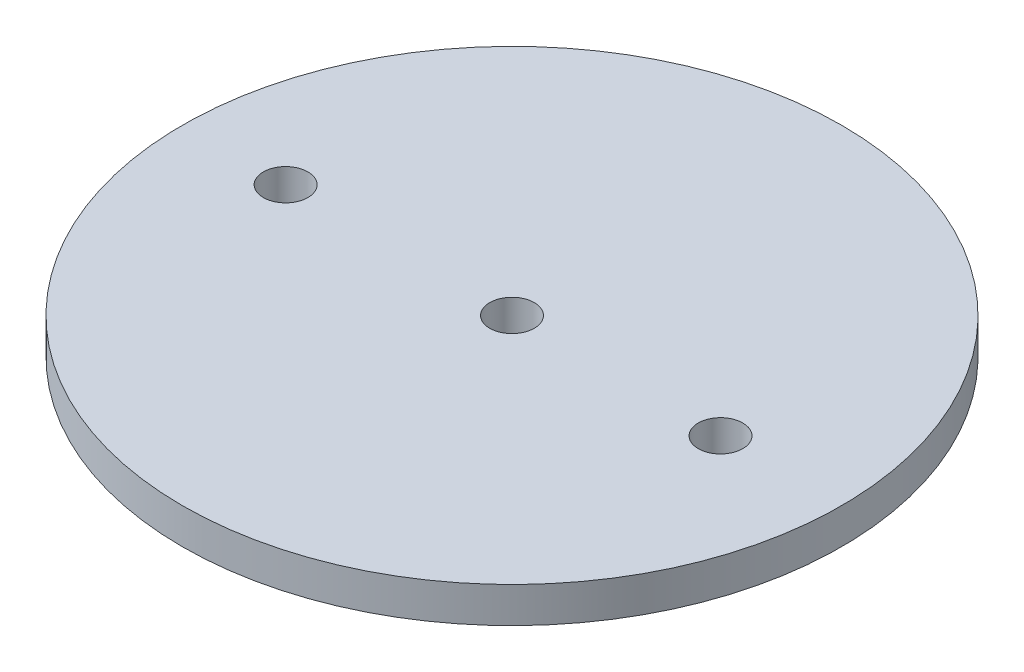
ISO-10303-21;
HEADER;
FILE_DESCRIPTION(('STEP AP214'),'2;1');
FILE_NAME('part.step','',(''),(''),'','','');
FILE_SCHEMA(('AUTOMOTIVE_DESIGN { 1 0 10303 214 1 1 1 1 }'));
ENDSEC;
DATA;
#1=APPLICATION_CONTEXT('core data for automotive mechanical design processes');
#2=APPLICATION_PROTOCOL_DEFINITION('international standard','automotive_design',2000,#1);
#3=PRODUCT_CONTEXT('',#1,'mechanical');
#4=PRODUCT('Part','Part','',(#3));
#5=PRODUCT_RELATED_PRODUCT_CATEGORY('part','',(#4));
#6=PRODUCT_DEFINITION_FORMATION('','',#4);
#7=PRODUCT_DEFINITION_CONTEXT('part definition',#1,'design');
#8=PRODUCT_DEFINITION('design','',#6,#7);
#9=PRODUCT_DEFINITION_SHAPE('','',#8);
#10=(LENGTH_UNIT() NAMED_UNIT(*) SI_UNIT(.MILLI.,.METRE.));
#11=(NAMED_UNIT(*) PLANE_ANGLE_UNIT() SI_UNIT($,.RADIAN.));
#12=(NAMED_UNIT(*) SI_UNIT($,.STERADIAN.) SOLID_ANGLE_UNIT());
#13=UNCERTAINTY_MEASURE_WITH_UNIT(LENGTH_MEASURE(1.E-05),#10,'distance_accuracy_value','');
#14=(GEOMETRIC_REPRESENTATION_CONTEXT(3) GLOBAL_UNCERTAINTY_ASSIGNED_CONTEXT((#13)) GLOBAL_UNIT_ASSIGNED_CONTEXT((#10,
#11,#12)) REPRESENTATION_CONTEXT('',''));
#15=CARTESIAN_POINT('',(0.,0.,0.));
#16=DIRECTION('',(0.,0.,1.));
#17=DIRECTION('',(1.,0.,0.));
#18=AXIS2_PLACEMENT_3D('',#15,#16,#17);
#19=CARTESIAN_POINT('',(0.,5.08,0.));
#20=DIRECTION('',(0.,-1.,0.));
#21=DIRECTION('',(0.,0.,-1.));
#22=AXIS2_PLACEMENT_3D('',#19,#20,#21);
#23=CYLINDRICAL_SURFACE('',#22,46.99);
#24=CARTESIAN_POINT('',(0.,5.08,0.));
#25=DIRECTION('',(0.,1.,0.));
#26=DIRECTION('',(0.,0.,1.));
#27=AXIS2_PLACEMENT_3D('',#24,#25,#26);
#28=CIRCLE('',#27,46.99);
#29=CARTESIAN_POINT('',(0.,5.08,46.99));
#30=VERTEX_POINT('',#29);
#31=EDGE_CURVE('E10',#30,#30,#28,.T.);
#32=ORIENTED_EDGE('',*,*,#31,.F.);
#33=EDGE_LOOP('',(#32));
#34=FACE_BOUND('',#33,.T.);
#35=CARTESIAN_POINT('',(0.,0.,0.));
#36=DIRECTION('',(0.,1.,0.));
#37=DIRECTION('',(0.,0.,1.));
#38=AXIS2_PLACEMENT_3D('',#35,#36,#37);
#39=CIRCLE('',#38,46.99);
#40=CARTESIAN_POINT('',(0.,0.,46.99));
#41=VERTEX_POINT('',#40);
#42=EDGE_CURVE('E40',#41,#41,#39,.T.);
#43=ORIENTED_EDGE('',*,*,#42,.T.);
#44=EDGE_LOOP('',(#43));
#45=FACE_BOUND('',#44,.T.);
#46=ADVANCED_FACE('F37',(#34,#45),#23,.T.);
#47=CARTESIAN_POINT('',(0.,5.08,0.));
#48=DIRECTION('',(0.,1.,0.));
#49=DIRECTION('',(0.,0.,1.));
#50=AXIS2_PLACEMENT_3D('',#47,#48,#49);
#51=PLANE('',#50);
#52=CARTESIAN_POINT('',(-32.2779718521836,5.08,0.));
#53=DIRECTION('',(0.,1.,0.));
#54=DIRECTION('',(0.,0.,1.));
#55=AXIS2_PLACEMENT_3D('',#52,#53,#54);
#56=CIRCLE('',#55,3.175);
#57=CARTESIAN_POINT('',(-32.2779718521836,5.08,3.175));
#58=VERTEX_POINT('',#57);
#59=EDGE_CURVE('E67',#58,#58,#56,.T.);
#60=ORIENTED_EDGE('',*,*,#59,.F.);
#61=EDGE_LOOP('',(#60));
#62=FACE_BOUND('',#61,.T.);
#63=CARTESIAN_POINT('',(0.,5.08,0.));
#64=DIRECTION('',(0.,1.,0.));
#65=DIRECTION('',(0.,0.,1.));
#66=AXIS2_PLACEMENT_3D('',#63,#64,#65);
#67=CIRCLE('',#66,3.175);
#68=CARTESIAN_POINT('',(0.,5.08,3.175));
#69=VERTEX_POINT('',#68);
#70=EDGE_CURVE('E59',#69,#69,#67,.T.);
#71=ORIENTED_EDGE('',*,*,#70,.F.);
#72=EDGE_LOOP('',(#71));
#73=FACE_BOUND('',#72,.T.);
#74=CARTESIAN_POINT('',(29.7300213393057,5.08,0.));
#75=DIRECTION('',(0.,1.,0.));
#76=DIRECTION('',(0.,0.,1.));
#77=AXIS2_PLACEMENT_3D('',#74,#75,#76);
#78=CIRCLE('',#77,3.175);
#79=CARTESIAN_POINT('',(29.7300213393057,5.08,3.175));
#80=VERTEX_POINT('',#79);
#81=EDGE_CURVE('E51',#80,#80,#78,.T.);
#82=ORIENTED_EDGE('',*,*,#81,.F.);
#83=EDGE_LOOP('',(#82));
#84=FACE_BOUND('',#83,.T.);
#85=ORIENTED_EDGE('',*,*,#31,.T.);
#86=EDGE_LOOP('',(#85));
#87=FACE_BOUND('',#86,.T.);
#88=ADVANCED_FACE('F85',(#62,#73,#84,#87),#51,.T.);
#89=CARTESIAN_POINT('',(0.,0.,0.));
#90=DIRECTION('',(0.,1.,0.));
#91=DIRECTION('',(0.,0.,1.));
#92=AXIS2_PLACEMENT_3D('',#89,#90,#91);
#93=PLANE('',#92);
#94=CARTESIAN_POINT('',(-32.2779718521836,0.,0.));
#95=DIRECTION('',(0.,1.,0.));
#96=DIRECTION('',(0.,0.,1.));
#97=AXIS2_PLACEMENT_3D('',#94,#95,#96);
#98=CIRCLE('',#97,3.175);
#99=CARTESIAN_POINT('',(-32.2779718521836,0.,3.175));
#100=VERTEX_POINT('',#99);
#101=EDGE_CURVE('E49',#100,#100,#98,.T.);
#102=ORIENTED_EDGE('',*,*,#101,.T.);
#103=EDGE_LOOP('',(#102));
#104=FACE_BOUND('',#103,.T.);
#105=CARTESIAN_POINT('',(0.,0.,0.));
#106=DIRECTION('',(0.,1.,0.));
#107=DIRECTION('',(0.,0.,1.));
#108=AXIS2_PLACEMENT_3D('',#105,#106,#107);
#109=CIRCLE('',#108,3.175);
#110=CARTESIAN_POINT('',(0.,0.,3.175));
#111=VERTEX_POINT('',#110);
#112=EDGE_CURVE('E63',#111,#111,#109,.T.);
#113=ORIENTED_EDGE('',*,*,#112,.T.);
#114=EDGE_LOOP('',(#113));
#115=FACE_BOUND('',#114,.T.);
#116=CARTESIAN_POINT('',(29.7300213393057,0.,0.));
#117=DIRECTION('',(0.,1.,0.));
#118=DIRECTION('',(0.,0.,1.));
#119=AXIS2_PLACEMENT_3D('',#116,#117,#118);
#120=CIRCLE('',#119,3.175);
#121=CARTESIAN_POINT('',(29.7300213393057,0.,3.175));
#122=VERTEX_POINT('',#121);
#123=EDGE_CURVE('E55',#122,#122,#120,.T.);
#124=ORIENTED_EDGE('',*,*,#123,.T.);
#125=EDGE_LOOP('',(#124));
#126=FACE_BOUND('',#125,.T.);
#127=ORIENTED_EDGE('',*,*,#42,.F.);
#128=EDGE_LOOP('',(#127));
#129=FACE_BOUND('',#128,.T.);
#130=ADVANCED_FACE('F75',(#104,#115,#126,#129),#93,.F.);
#131=CARTESIAN_POINT('',(29.7300213393057,0.,0.));
#132=DIRECTION('',(0.,1.,0.));
#133=DIRECTION('',(0.,0.,1.));
#134=AXIS2_PLACEMENT_3D('',#131,#132,#133);
#135=CYLINDRICAL_SURFACE('',#134,3.175);
#136=ORIENTED_EDGE('',*,*,#123,.F.);
#137=EDGE_LOOP('',(#136));
#138=FACE_BOUND('',#137,.T.);
#139=ORIENTED_EDGE('',*,*,#81,.T.);
#140=EDGE_LOOP('',(#139));
#141=FACE_BOUND('',#140,.T.);
#142=ADVANCED_FACE('F93',(#138,#141),#135,.F.);
#143=CARTESIAN_POINT('',(0.,0.,0.));
#144=DIRECTION('',(0.,1.,0.));
#145=DIRECTION('',(0.,0.,1.));
#146=AXIS2_PLACEMENT_3D('',#143,#144,#145);
#147=CYLINDRICAL_SURFACE('',#146,3.175);
#148=ORIENTED_EDGE('',*,*,#112,.F.);
#149=EDGE_LOOP('',(#148));
#150=FACE_BOUND('',#149,.T.);
#151=ORIENTED_EDGE('',*,*,#70,.T.);
#152=EDGE_LOOP('',(#151));
#153=FACE_BOUND('',#152,.T.);
#154=ADVANCED_FACE('F81',(#150,#153),#147,.F.);
#155=CARTESIAN_POINT('',(-32.2779718521836,0.,0.));
#156=DIRECTION('',(0.,1.,0.));
#157=DIRECTION('',(0.,0.,1.));
#158=AXIS2_PLACEMENT_3D('',#155,#156,#157);
#159=CYLINDRICAL_SURFACE('',#158,3.175);
#160=ORIENTED_EDGE('',*,*,#101,.F.);
#161=EDGE_LOOP('',(#160));
#162=FACE_BOUND('',#161,.T.);
#163=ORIENTED_EDGE('',*,*,#59,.T.);
#164=EDGE_LOOP('',(#163));
#165=FACE_BOUND('',#164,.T.);
#166=ADVANCED_FACE('F78',(#162,#165),#159,.F.);
#167=CLOSED_SHELL('',(#46,#88,#130,#142,#154,#166));
#168=MANIFOLD_SOLID_BREP('B2',#167);
#169=ADVANCED_BREP_SHAPE_REPRESENTATION('',(#18,#168),#14);
#170=SHAPE_DEFINITION_REPRESENTATION(#9,#169);
ENDSEC;
END-ISO-10303-21;
